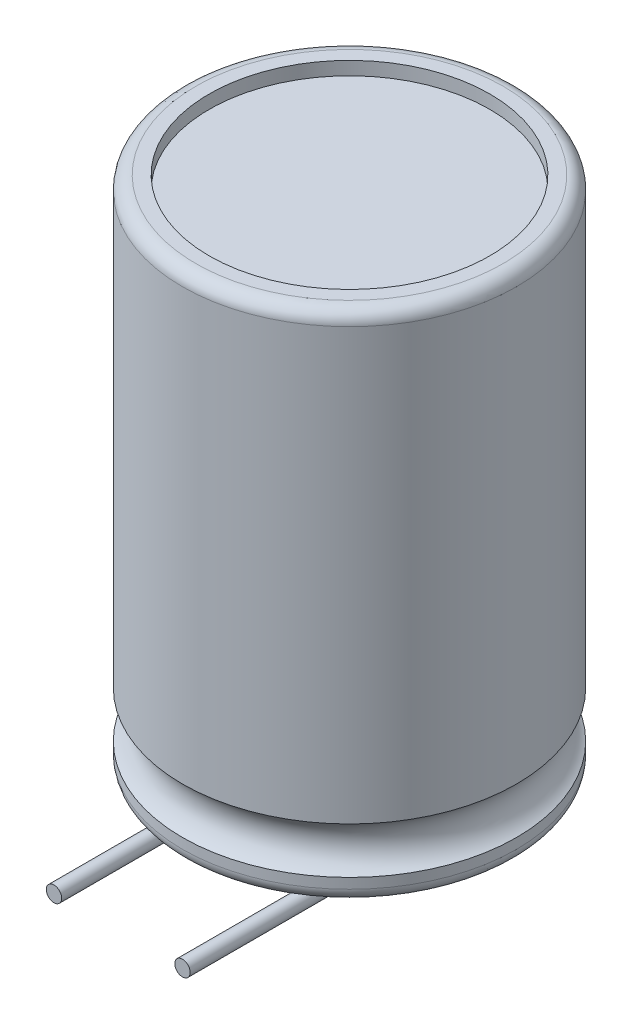
ISO-10303-21;
HEADER;
FILE_DESCRIPTION(('STEP AP214'),'2;1');
FILE_NAME('part.step','',(''),(''),'','','');
FILE_SCHEMA(('AUTOMOTIVE_DESIGN { 1 0 10303 214 1 1 1 1 }'));
ENDSEC;
DATA;
#1=APPLICATION_CONTEXT('core data for automotive mechanical design processes');
#2=APPLICATION_PROTOCOL_DEFINITION('international standard','automotive_design',2000,#1);
#3=PRODUCT_CONTEXT('',#1,'mechanical');
#4=PRODUCT('Part','Part','',(#3));
#5=PRODUCT_RELATED_PRODUCT_CATEGORY('part','',(#4));
#6=PRODUCT_DEFINITION_FORMATION('','',#4);
#7=PRODUCT_DEFINITION_CONTEXT('part definition',#1,'design');
#8=PRODUCT_DEFINITION('design','',#6,#7);
#9=PRODUCT_DEFINITION_SHAPE('','',#8);
#10=(LENGTH_UNIT() NAMED_UNIT(*) SI_UNIT(.MILLI.,.METRE.));
#11=(NAMED_UNIT(*) PLANE_ANGLE_UNIT() SI_UNIT($,.RADIAN.));
#12=(NAMED_UNIT(*) SI_UNIT($,.STERADIAN.) SOLID_ANGLE_UNIT());
#13=UNCERTAINTY_MEASURE_WITH_UNIT(LENGTH_MEASURE(1.E-05),#10,'distance_accuracy_value','');
#14=(GEOMETRIC_REPRESENTATION_CONTEXT(3) GLOBAL_UNCERTAINTY_ASSIGNED_CONTEXT((#13)) GLOBAL_UNIT_ASSIGNED_CONTEXT((#10,
#11,#12)) REPRESENTATION_CONTEXT('',''));
#15=CARTESIAN_POINT('',(0.,0.,0.));
#16=DIRECTION('',(0.,0.,1.));
#17=DIRECTION('',(1.,0.,0.));
#18=AXIS2_PLACEMENT_3D('',#15,#16,#17);
#19=CARTESIAN_POINT('',(0.,0.52,0.));
#20=DIRECTION('',(0.,-1.,0.));
#21=DIRECTION('',(0.,0.,-1.));
#22=AXIS2_PLACEMENT_3D('',#19,#20,#21);
#23=PLANE('',#22);
#24=CARTESIAN_POINT('',(-2.5,0.52,0.));
#25=DIRECTION('',(0.,1.,0.));
#26=DIRECTION('',(0.,0.,1.));
#27=AXIS2_PLACEMENT_3D('',#24,#25,#26);
#28=CIRCLE('',#27,0.3);
#29=CARTESIAN_POINT('',(-2.5,0.52,0.3));
#30=VERTEX_POINT('',#29);
#31=EDGE_CURVE('E78',#30,#30,#28,.T.);
#32=ORIENTED_EDGE('',*,*,#31,.T.);
#33=EDGE_LOOP('',(#32));
#34=FACE_BOUND('',#33,.T.);
#35=CARTESIAN_POINT('',(0.,0.52,0.));
#36=DIRECTION('',(0.,-1.,0.));
#37=DIRECTION('',(0.,0.,-1.));
#38=AXIS2_PLACEMENT_3D('',#35,#36,#37);
#39=CIRCLE('',#38,5.46);
#40=CARTESIAN_POINT('',(0.,0.52,-5.46));
#41=VERTEX_POINT('',#40);
#42=EDGE_CURVE('E40',#41,#41,#39,.T.);
#43=ORIENTED_EDGE('',*,*,#42,.T.);
#44=EDGE_LOOP('',(#43));
#45=FACE_BOUND('',#44,.T.);
#46=CARTESIAN_POINT('',(2.5,0.52,0.));
#47=DIRECTION('',(0.,1.,0.));
#48=DIRECTION('',(0.,0.,1.));
#49=AXIS2_PLACEMENT_3D('',#46,#47,#48);
#50=CIRCLE('',#49,0.3);
#51=CARTESIAN_POINT('',(2.5,0.52,0.3));
#52=VERTEX_POINT('',#51);
#53=EDGE_CURVE('E90',#52,#52,#50,.T.);
#54=ORIENTED_EDGE('',*,*,#53,.T.);
#55=EDGE_LOOP('',(#54));
#56=FACE_BOUND('',#55,.T.);
#57=ADVANCED_FACE('F33',(#34,#45,#56),#23,.T.);
#58=CARTESIAN_POINT('',(0.,0.52,0.));
#59=DIRECTION('',(0.,-1.,0.));
#60=DIRECTION('',(0.,0.,-1.));
#61=AXIS2_PLACEMENT_3D('',#58,#59,#60);
#62=CYLINDRICAL_SURFACE('',#61,5.46);
#63=CARTESIAN_POINT('',(0.,19.48,0.));
#64=DIRECTION('',(0.,-1.,0.));
#65=DIRECTION('',(0.,0.,-1.));
#66=AXIS2_PLACEMENT_3D('',#63,#64,#65);
#67=CIRCLE('',#66,5.46);
#68=CARTESIAN_POINT('',(0.,19.48,-5.46));
#69=VERTEX_POINT('',#68);
#70=EDGE_CURVE('E10',#69,#69,#67,.T.);
#71=ORIENTED_EDGE('',*,*,#70,.T.);
#72=EDGE_LOOP('',(#71));
#73=FACE_BOUND('',#72,.T.);
#74=CARTESIAN_POINT('',(0.,20.,0.));
#75=DIRECTION('',(0.,-1.,0.));
#76=DIRECTION('',(0.,0.,-1.));
#77=AXIS2_PLACEMENT_3D('',#74,#75,#76);
#78=CIRCLE('',#77,5.46);
#79=CARTESIAN_POINT('',(0.,20.,-5.46));
#80=VERTEX_POINT('',#79);
#81=EDGE_CURVE('E68',#80,#80,#78,.T.);
#82=ORIENTED_EDGE('',*,*,#81,.F.);
#83=EDGE_LOOP('',(#82));
#84=FACE_BOUND('',#83,.T.);
#85=ADVANCED_FACE('F35',(#73,#84),#62,.F.);
#86=CARTESIAN_POINT('',(5.46,19.48,0.));
#87=DIRECTION('',(0.,1.,0.));
#88=DIRECTION('',(0.,0.,1.));
#89=AXIS2_PLACEMENT_3D('',#86,#87,#88);
#90=PLANE('',#89);
#91=ORIENTED_EDGE('',*,*,#70,.F.);
#92=EDGE_LOOP('',(#91));
#93=FACE_BOUND('',#92,.T.);
#94=ADVANCED_FACE('F125',(#93),#90,.T.);
#95=CARTESIAN_POINT('',(0.,0.52,0.));
#96=DIRECTION('',(0.,-1.,0.));
#97=DIRECTION('',(0.,0.,-1.));
#98=AXIS2_PLACEMENT_3D('',#95,#96,#97);
#99=CYLINDRICAL_SURFACE('',#98,5.46);
#100=CARTESIAN_POINT('',(0.,0.,0.));
#101=DIRECTION('',(0.,-1.,0.));
#102=DIRECTION('',(0.,0.,-1.));
#103=AXIS2_PLACEMENT_3D('',#100,#101,#102);
#104=CIRCLE('',#103,5.46);
#105=CARTESIAN_POINT('',(0.,0.,-5.46));
#106=VERTEX_POINT('',#105);
#107=EDGE_CURVE('E44',#106,#106,#104,.T.);
#108=ORIENTED_EDGE('',*,*,#107,.T.);
#109=EDGE_LOOP('',(#108));
#110=FACE_BOUND('',#109,.T.);
#111=ORIENTED_EDGE('',*,*,#42,.F.);
#112=EDGE_LOOP('',(#111));
#113=FACE_BOUND('',#112,.T.);
#114=ADVANCED_FACE('F127',(#110,#113),#99,.F.);
#115=CARTESIAN_POINT('',(5.46,0.,0.));
#116=DIRECTION('',(0.,-1.,0.));
#117=DIRECTION('',(0.,0.,-1.));
#118=AXIS2_PLACEMENT_3D('',#115,#116,#117);
#119=PLANE('',#118);
#120=CARTESIAN_POINT('',(0.,0.,0.));
#121=DIRECTION('',(0.,-1.,0.));
#122=DIRECTION('',(0.,0.,-1.));
#123=AXIS2_PLACEMENT_3D('',#120,#121,#122);
#124=CIRCLE('',#123,5.98);
#125=CARTESIAN_POINT('',(0.,0.,-5.98));
#126=VERTEX_POINT('',#125);
#127=EDGE_CURVE('E48',#126,#126,#124,.T.);
#128=ORIENTED_EDGE('',*,*,#127,.T.);
#129=EDGE_LOOP('',(#128));
#130=FACE_BOUND('',#129,.T.);
#131=ORIENTED_EDGE('',*,*,#107,.F.);
#132=EDGE_LOOP('',(#131));
#133=FACE_BOUND('',#132,.T.);
#134=ADVANCED_FACE('F134',(#130,#133),#119,.T.);
#135=CARTESIAN_POINT('',(0.,0.52,0.));
#136=DIRECTION('',(0.,-1.,0.));
#137=DIRECTION('',(0.,0.,-1.));
#138=AXIS2_PLACEMENT_3D('',#135,#136,#137);
#139=TOROIDAL_SURFACE('',#138,5.98,0.52);
#140=CARTESIAN_POINT('',(0.,0.52,0.));
#141=DIRECTION('',(0.,-1.,0.));
#142=DIRECTION('',(0.,0.,-1.));
#143=AXIS2_PLACEMENT_3D('',#140,#141,#142);
#144=CIRCLE('',#143,6.5);
#145=CARTESIAN_POINT('',(0.,0.52,-6.5));
#146=VERTEX_POINT('',#145);
#147=EDGE_CURVE('E53',#146,#146,#144,.T.);
#148=ORIENTED_EDGE('',*,*,#147,.T.);
#149=EDGE_LOOP('',(#148));
#150=FACE_BOUND('',#149,.T.);
#151=ORIENTED_EDGE('',*,*,#127,.F.);
#152=EDGE_LOOP('',(#151));
#153=FACE_BOUND('',#152,.T.);
#154=ADVANCED_FACE('F139',(#150,#153),#139,.T.);
#155=CARTESIAN_POINT('',(0.,0.52,0.));
#156=DIRECTION('',(0.,-1.,0.));
#157=DIRECTION('',(0.,0.,-1.));
#158=AXIS2_PLACEMENT_3D('',#155,#156,#157);
#159=CYLINDRICAL_SURFACE('',#158,6.5);
#160=CARTESIAN_POINT('',(0.,0.919333580064183,0.));
#161=DIRECTION('',(0.,-1.,0.));
#162=DIRECTION('',(0.,0.,-1.));
#163=AXIS2_PLACEMENT_3D('',#160,#161,#162);
#164=CIRCLE('',#163,6.5);
#165=CARTESIAN_POINT('',(0.,0.919333580064183,-6.5));
#166=VERTEX_POINT('',#165);
#167=EDGE_CURVE('E56',#166,#166,#164,.T.);
#168=ORIENTED_EDGE('',*,*,#167,.T.);
#169=EDGE_LOOP('',(#168));
#170=FACE_BOUND('',#169,.T.);
#171=ORIENTED_EDGE('',*,*,#147,.F.);
#172=EDGE_LOOP('',(#171));
#173=FACE_BOUND('',#172,.T.);
#174=ADVANCED_FACE('F147',(#170,#173),#159,.T.);
#175=CARTESIAN_POINT('',(0.,1.82,0.));
#176=DIRECTION('',(0.,-1.,0.));
#177=DIRECTION('',(0.,0.,-1.));
#178=AXIS2_PLACEMENT_3D('',#175,#176,#177);
#179=TOROIDAL_SURFACE('',#178,7.02,1.04);
#180=CARTESIAN_POINT('',(0.,2.72066641993582,0.));
#181=DIRECTION('',(0.,-1.,0.));
#182=DIRECTION('',(0.,0.,-1.));
#183=AXIS2_PLACEMENT_3D('',#180,#181,#182);
#184=CIRCLE('',#183,6.5);
#185=CARTESIAN_POINT('',(0.,2.72066641993582,-6.5));
#186=VERTEX_POINT('',#185);
#187=EDGE_CURVE('E59',#186,#186,#184,.T.);
#188=ORIENTED_EDGE('',*,*,#187,.T.);
#189=EDGE_LOOP('',(#188));
#190=FACE_BOUND('',#189,.T.);
#191=ORIENTED_EDGE('',*,*,#167,.F.);
#192=EDGE_LOOP('',(#191));
#193=FACE_BOUND('',#192,.T.);
#194=ADVANCED_FACE('F153',(#190,#193),#179,.F.);
#195=CARTESIAN_POINT('',(0.,0.52,0.));
#196=DIRECTION('',(0.,-1.,0.));
#197=DIRECTION('',(0.,0.,-1.));
#198=AXIS2_PLACEMENT_3D('',#195,#196,#197);
#199=CYLINDRICAL_SURFACE('',#198,6.5);
#200=CARTESIAN_POINT('',(0.,19.48,0.));
#201=DIRECTION('',(0.,-1.,0.));
#202=DIRECTION('',(0.,0.,-1.));
#203=AXIS2_PLACEMENT_3D('',#200,#201,#202);
#204=CIRCLE('',#203,6.5);
#205=CARTESIAN_POINT('',(0.,19.48,-6.5));
#206=VERTEX_POINT('',#205);
#207=EDGE_CURVE('E62',#206,#206,#204,.T.);
#208=ORIENTED_EDGE('',*,*,#207,.T.);
#209=EDGE_LOOP('',(#208));
#210=FACE_BOUND('',#209,.T.);
#211=ORIENTED_EDGE('',*,*,#187,.F.);
#212=EDGE_LOOP('',(#211));
#213=FACE_BOUND('',#212,.T.);
#214=ADVANCED_FACE('F157',(#210,#213),#199,.T.);
#215=CARTESIAN_POINT('',(0.,19.48,0.));
#216=DIRECTION('',(0.,-1.,0.));
#217=DIRECTION('',(0.,0.,-1.));
#218=AXIS2_PLACEMENT_3D('',#215,#216,#217);
#219=TOROIDAL_SURFACE('',#218,5.98,0.52);
#220=CARTESIAN_POINT('',(0.,20.,0.));
#221=DIRECTION('',(0.,-1.,0.));
#222=DIRECTION('',(0.,0.,-1.));
#223=AXIS2_PLACEMENT_3D('',#220,#221,#222);
#224=CIRCLE('',#223,5.98);
#225=CARTESIAN_POINT('',(0.,20.,-5.98));
#226=VERTEX_POINT('',#225);
#227=EDGE_CURVE('E65',#226,#226,#224,.T.);
#228=ORIENTED_EDGE('',*,*,#227,.T.);
#229=EDGE_LOOP('',(#228));
#230=FACE_BOUND('',#229,.T.);
#231=ORIENTED_EDGE('',*,*,#207,.F.);
#232=EDGE_LOOP('',(#231));
#233=FACE_BOUND('',#232,.T.);
#234=ADVANCED_FACE('F161',(#230,#233),#219,.T.);
#235=CARTESIAN_POINT('',(5.46,20.,0.));
#236=DIRECTION('',(0.,1.,0.));
#237=DIRECTION('',(0.,0.,1.));
#238=AXIS2_PLACEMENT_3D('',#235,#236,#237);
#239=PLANE('',#238);
#240=ORIENTED_EDGE('',*,*,#81,.T.);
#241=EDGE_LOOP('',(#240));
#242=FACE_BOUND('',#241,.T.);
#243=ORIENTED_EDGE('',*,*,#227,.F.);
#244=EDGE_LOOP('',(#243));
#245=FACE_BOUND('',#244,.T.);
#246=ADVANCED_FACE('F165',(#242,#245),#239,.T.);
#247=CARTESIAN_POINT('',(-2.5,-0.98,1.));
#248=DIRECTION('',(0.,0.,1.));
#249=DIRECTION('',(0.,-1.,0.));
#250=AXIS2_PLACEMENT_3D('',#247,#248,#249);
#251=CYLINDRICAL_SURFACE('',#250,0.3);
#252=CARTESIAN_POINT('',(-2.5,-0.98,1.));
#253=DIRECTION('',(0.,0.,-1.));
#254=DIRECTION('',(0.,1.,0.));
#255=AXIS2_PLACEMENT_3D('',#252,#253,#254);
#256=CIRCLE('',#255,0.3);
#257=CARTESIAN_POINT('',(-2.5,-1.28,1.));
#258=VERTEX_POINT('',#257);
#259=EDGE_CURVE('E74',#258,#258,#256,.T.);
#260=ORIENTED_EDGE('',*,*,#259,.F.);
#261=EDGE_LOOP('',(#260));
#262=FACE_BOUND('',#261,.T.);
#263=CARTESIAN_POINT('',(-2.5,-0.980000000000001,9.));
#264=DIRECTION('',(0.,0.,-1.));
#265=DIRECTION('',(0.,1.,0.));
#266=AXIS2_PLACEMENT_3D('',#263,#264,#265);
#267=CIRCLE('',#266,0.3);
#268=CARTESIAN_POINT('',(-2.5,-0.680000000000001,9.));
#269=VERTEX_POINT('',#268);
#270=EDGE_CURVE('E71',#269,#269,#267,.T.);
#271=ORIENTED_EDGE('',*,*,#270,.T.);
#272=EDGE_LOOP('',(#271));
#273=FACE_BOUND('',#272,.T.);
#274=ADVANCED_FACE('F169',(#262,#273),#251,.T.);
#275=CARTESIAN_POINT('',(-2.5,0.0199999999999998,1.));
#276=DIRECTION('',(-1.,0.,0.));
#277=DIRECTION('',(0.,0.,1.));
#278=AXIS2_PLACEMENT_3D('',#275,#276,#277);
#279=TOROIDAL_SURFACE('',#278,1.,0.3);
#280=CARTESIAN_POINT('',(-2.5,0.0199999999999998,0.));
#281=DIRECTION('',(0.,1.,0.));
#282=DIRECTION('',(0.,0.,1.));
#283=AXIS2_PLACEMENT_3D('',#280,#281,#282);
#284=CIRCLE('',#283,0.3);
#285=CARTESIAN_POINT('',(-2.5,0.0199999999999998,-0.3));
#286=VERTEX_POINT('',#285);
#287=EDGE_CURVE('E77',#286,#286,#284,.T.);
#288=CARTESIAN_POINT('',(-2.5,0.0199999999999998,1.));
#289=DIRECTION('',(-1.,0.,0.));
#290=DIRECTION('',(0.,0.,1.));
#291=AXIS2_PLACEMENT_3D('',#288,#289,#290);
#292=CIRCLE('',#291,1.3);
#293=EDGE_CURVE('',#286,#258,#292,.T.);
#294=ORIENTED_EDGE('',*,*,#287,.F.);
#295=ORIENTED_EDGE('',*,*,#259,.T.);
#296=ORIENTED_EDGE('',*,*,#293,.T.);
#297=ORIENTED_EDGE('',*,*,#293,.F.);
#298=EDGE_LOOP('',(#294,#296,#295,#297));
#299=FACE_BOUND('',#298,.T.);
#300=ADVANCED_FACE('F173',(#299),#279,.T.);
#301=CARTESIAN_POINT('',(-2.5,0.0199999999999998,0.));
#302=DIRECTION('',(0.,1.,0.));
#303=DIRECTION('',(0.,0.,1.));
#304=AXIS2_PLACEMENT_3D('',#301,#302,#303);
#305=CYLINDRICAL_SURFACE('',#304,0.3);
#306=ORIENTED_EDGE('',*,*,#287,.T.);
#307=EDGE_LOOP('',(#306));
#308=FACE_BOUND('',#307,.T.);
#309=ORIENTED_EDGE('',*,*,#31,.F.);
#310=EDGE_LOOP('',(#309));
#311=FACE_BOUND('',#310,.T.);
#312=ADVANCED_FACE('F177',(#308,#311),#305,.T.);
#313=CARTESIAN_POINT('',(-2.5,-0.980000000000001,9.));
#314=DIRECTION('',(0.,0.,-1.));
#315=DIRECTION('',(0.,1.,0.));
#316=AXIS2_PLACEMENT_3D('',#313,#314,#315);
#317=PLANE('',#316);
#318=ORIENTED_EDGE('',*,*,#270,.F.);
#319=EDGE_LOOP('',(#318));
#320=FACE_BOUND('',#319,.T.);
#321=ADVANCED_FACE('F108',(#320),#317,.F.);
#322=CARTESIAN_POINT('',(2.5,-0.98,1.));
#323=DIRECTION('',(0.,0.,1.));
#324=DIRECTION('',(0.,-1.,0.));
#325=AXIS2_PLACEMENT_3D('',#322,#323,#324);
#326=CYLINDRICAL_SURFACE('',#325,0.3);
#327=CARTESIAN_POINT('',(2.5,-0.98,1.));
#328=DIRECTION('',(0.,0.,-1.));
#329=DIRECTION('',(0.,1.,0.));
#330=AXIS2_PLACEMENT_3D('',#327,#328,#329);
#331=CIRCLE('',#330,0.3);
#332=CARTESIAN_POINT('',(2.5,-1.28,1.));
#333=VERTEX_POINT('',#332);
#334=EDGE_CURVE('E86',#333,#333,#331,.T.);
#335=ORIENTED_EDGE('',*,*,#334,.F.);
#336=EDGE_LOOP('',(#335));
#337=FACE_BOUND('',#336,.T.);
#338=CARTESIAN_POINT('',(2.5,-0.980000000000001,9.));
#339=DIRECTION('',(0.,0.,-1.));
#340=DIRECTION('',(0.,1.,0.));
#341=AXIS2_PLACEMENT_3D('',#338,#339,#340);
#342=CIRCLE('',#341,0.3);
#343=CARTESIAN_POINT('',(2.5,-0.680000000000001,9.));
#344=VERTEX_POINT('',#343);
#345=EDGE_CURVE('E81',#344,#344,#342,.T.);
#346=ORIENTED_EDGE('',*,*,#345,.T.);
#347=EDGE_LOOP('',(#346));
#348=FACE_BOUND('',#347,.T.);
#349=ADVANCED_FACE('F102',(#337,#348),#326,.T.);
#350=CARTESIAN_POINT('',(2.5,0.0199999999999998,1.));
#351=DIRECTION('',(-1.,0.,0.));
#352=DIRECTION('',(0.,0.,1.));
#353=AXIS2_PLACEMENT_3D('',#350,#351,#352);
#354=TOROIDAL_SURFACE('',#353,1.,0.3);
#355=CARTESIAN_POINT('',(2.5,0.0199999999999998,0.));
#356=DIRECTION('',(0.,1.,0.));
#357=DIRECTION('',(0.,0.,1.));
#358=AXIS2_PLACEMENT_3D('',#355,#356,#357);
#359=CIRCLE('',#358,0.3);
#360=CARTESIAN_POINT('',(2.5,0.0199999999999998,-0.3));
#361=VERTEX_POINT('',#360);
#362=EDGE_CURVE('E89',#361,#361,#359,.T.);
#363=CARTESIAN_POINT('',(2.5,0.0199999999999998,1.));
#364=DIRECTION('',(-1.,0.,0.));
#365=DIRECTION('',(0.,0.,1.));
#366=AXIS2_PLACEMENT_3D('',#363,#364,#365);
#367=CIRCLE('',#366,1.3);
#368=EDGE_CURVE('',#361,#333,#367,.T.);
#369=ORIENTED_EDGE('',*,*,#362,.F.);
#370=ORIENTED_EDGE('',*,*,#334,.T.);
#371=ORIENTED_EDGE('',*,*,#368,.T.);
#372=ORIENTED_EDGE('',*,*,#368,.F.);
#373=EDGE_LOOP('',(#369,#371,#370,#372));
#374=FACE_BOUND('',#373,.T.);
#375=ADVANCED_FACE('F99',(#374),#354,.T.);
#376=CARTESIAN_POINT('',(2.5,0.0199999999999998,0.));
#377=DIRECTION('',(0.,1.,0.));
#378=DIRECTION('',(0.,0.,1.));
#379=AXIS2_PLACEMENT_3D('',#376,#377,#378);
#380=CYLINDRICAL_SURFACE('',#379,0.3);
#381=ORIENTED_EDGE('',*,*,#362,.T.);
#382=EDGE_LOOP('',(#381));
#383=FACE_BOUND('',#382,.T.);
#384=ORIENTED_EDGE('',*,*,#53,.F.);
#385=EDGE_LOOP('',(#384));
#386=FACE_BOUND('',#385,.T.);
#387=ADVANCED_FACE('F96',(#383,#386),#380,.T.);
#388=CARTESIAN_POINT('',(2.5,-0.980000000000001,9.));
#389=DIRECTION('',(0.,0.,-1.));
#390=DIRECTION('',(0.,1.,0.));
#391=AXIS2_PLACEMENT_3D('',#388,#389,#390);
#392=PLANE('',#391);
#393=ORIENTED_EDGE('',*,*,#345,.F.);
#394=EDGE_LOOP('',(#393));
#395=FACE_BOUND('',#394,.T.);
#396=ADVANCED_FACE('F112',(#395),#392,.F.);
#397=CLOSED_SHELL('',(#57,#85,#94,#114,#134,#154,#174,#194,#214,#234,#246,#274,#300,#312,#321,
#349,#375,#387,#396));
#398=MANIFOLD_SOLID_BREP('B2',#397);
#399=ADVANCED_BREP_SHAPE_REPRESENTATION('',(#18,#398),#14);
#400=SHAPE_DEFINITION_REPRESENTATION(#9,#399);
ENDSEC;
END-ISO-10303-21;
